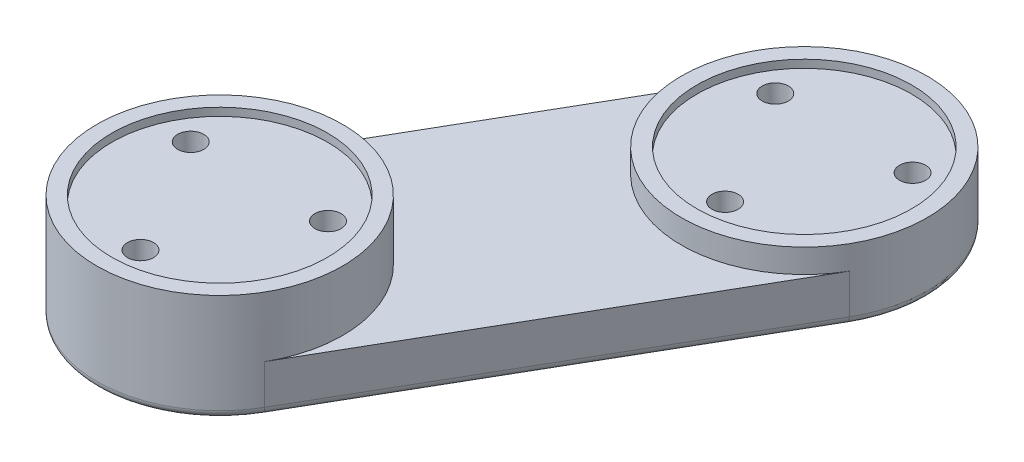
ISO-10303-21;
HEADER;
FILE_DESCRIPTION(('STEP AP214'),'2;1');
FILE_NAME('part.step','',(''),(''),'','','');
FILE_SCHEMA(('AUTOMOTIVE_DESIGN { 1 0 10303 214 1 1 1 1 }'));
ENDSEC;
DATA;
#1=APPLICATION_CONTEXT('core data for automotive mechanical design processes');
#2=APPLICATION_PROTOCOL_DEFINITION('international standard','automotive_design',2000,#1);
#3=PRODUCT_CONTEXT('',#1,'mechanical');
#4=PRODUCT('Part','Part','',(#3));
#5=PRODUCT_RELATED_PRODUCT_CATEGORY('part','',(#4));
#6=PRODUCT_DEFINITION_FORMATION('','',#4);
#7=PRODUCT_DEFINITION_CONTEXT('part definition',#1,'design');
#8=PRODUCT_DEFINITION('design','',#6,#7);
#9=PRODUCT_DEFINITION_SHAPE('','',#8);
#10=(LENGTH_UNIT() NAMED_UNIT(*) SI_UNIT(.MILLI.,.METRE.));
#11=(NAMED_UNIT(*) PLANE_ANGLE_UNIT() SI_UNIT($,.RADIAN.));
#12=(NAMED_UNIT(*) SI_UNIT($,.STERADIAN.) SOLID_ANGLE_UNIT());
#13=UNCERTAINTY_MEASURE_WITH_UNIT(LENGTH_MEASURE(1.E-05),#10,'distance_accuracy_value','');
#14=(GEOMETRIC_REPRESENTATION_CONTEXT(3) GLOBAL_UNCERTAINTY_ASSIGNED_CONTEXT((#13)) GLOBAL_UNIT_ASSIGNED_CONTEXT((#10,
#11,#12)) REPRESENTATION_CONTEXT('',''));
#15=CARTESIAN_POINT('',(0.,0.,0.));
#16=DIRECTION('',(0.,0.,1.));
#17=DIRECTION('',(1.,0.,0.));
#18=AXIS2_PLACEMENT_3D('',#15,#16,#17);
#19=CARTESIAN_POINT('',(2.25126265847052,64.,-99.5141091458864));
#20=DIRECTION('',(0.,1.,0.));
#21=DIRECTION('',(1.,0.,0.));
#22=AXIS2_PLACEMENT_3D('',#19,#20,#21);
#23=PLANE('',#22);
#24=CARTESIAN_POINT('',(2.25126265847052,64.,-99.5141091458864));
#25=DIRECTION('',(0.,1.,0.));
#26=DIRECTION('',(0.5,0.,-0.866025403784439));
#27=AXIS2_PLACEMENT_3D('',#24,#25,#26);
#28=CIRCLE('',#27,13.55);
#29=CARTESIAN_POINT('',(9.0262626584705,64.,-111.248753367165));
#30=VERTEX_POINT('',#29);
#31=EDGE_CURVE('E11',#30,#30,#28,.T.);
#32=ORIENTED_EDGE('',*,*,#31,.F.);
#33=EDGE_LOOP('',(#32));
#34=FACE_BOUND('',#33,.T.);
#35=CARTESIAN_POINT('',(2.25126265847052,64.,-99.5141091458864));
#36=DIRECTION('',(0.,1.,0.));
#37=DIRECTION('',(0.5,0.,-0.86602540378444));
#38=AXIS2_PLACEMENT_3D('',#35,#36,#37);
#39=CIRCLE('',#38,15.4999999999947);
#40=CARTESIAN_POINT('',(10.0012626584678,64.,-112.937502904541));
#41=VERTEX_POINT('',#40);
#42=EDGE_CURVE('E288',#41,#41,#39,.T.);
#43=ORIENTED_EDGE('',*,*,#42,.T.);
#44=EDGE_LOOP('',(#43));
#45=FACE_BOUND('',#44,.T.);
#46=ADVANCED_FACE('F16',(#34,#45),#23,.T.);
#47=CARTESIAN_POINT('',(2.25126265847052,64.,-99.5141091458864));
#48=DIRECTION('',(0.,-1.,0.));
#49=DIRECTION('',(-0.5,0.,0.866025403784439));
#50=AXIS2_PLACEMENT_3D('',#47,#48,#49);
#51=CYLINDRICAL_SURFACE('',#50,13.55);
#52=CARTESIAN_POINT('',(2.25126265847052,63.,-99.5141091458864));
#53=DIRECTION('',(0.,1.,0.));
#54=DIRECTION('',(0.5,0.,-0.866025403784439));
#55=AXIS2_PLACEMENT_3D('',#52,#53,#54);
#56=CIRCLE('',#55,13.55);
#57=CARTESIAN_POINT('',(9.0262626584705,63.,-111.248753367165));
#58=VERTEX_POINT('',#57);
#59=EDGE_CURVE('E366',#58,#58,#56,.T.);
#60=ORIENTED_EDGE('',*,*,#59,.F.);
#61=EDGE_LOOP('',(#60));
#62=FACE_BOUND('',#61,.T.);
#63=ORIENTED_EDGE('',*,*,#31,.T.);
#64=EDGE_LOOP('',(#63));
#65=FACE_BOUND('',#64,.T.);
#66=ADVANCED_FACE('F335',(#62,#65),#51,.F.);
#67=CARTESIAN_POINT('',(2.25126265847052,56.,-99.5141091458864));
#68=DIRECTION('',(0.,-1.,0.));
#69=DIRECTION('',(-0.5,0.,0.86602540378444));
#70=AXIS2_PLACEMENT_3D('',#67,#68,#69);
#71=TOROIDAL_SURFACE('',#70,14.4999999999947,1.);
#72=CARTESIAN_POINT('',(-10.3061056963993,56.,-106.764109145884));
#73=DIRECTION('',(0.5,0.,-0.86602540378444));
#74=DIRECTION('',(0.,-1.,0.));
#75=AXIS2_PLACEMENT_3D('',#72,#73,#74);
#76=CIRCLE('',#75,1.);
#77=CARTESIAN_POINT('',(-10.3061056963993,55.,-106.764109145884));
#78=VERTEX_POINT('',#77);
#79=CARTESIAN_POINT('',(-11.1721311001837,56.,-107.264109145884));
#80=VERTEX_POINT('',#79);
#81=EDGE_CURVE('E249',#78,#80,#76,.T.);
#82=ORIENTED_EDGE('',*,*,#81,.T.);
#83=CARTESIAN_POINT('',(2.25126265847052,56.,-99.5141091458864));
#84=DIRECTION('',(0.,1.,0.));
#85=DIRECTION('',(-0.5,0.,0.86602540378444));
#86=AXIS2_PLACEMENT_3D('',#83,#84,#85);
#87=CIRCLE('',#86,15.4999999999947);
#88=CARTESIAN_POINT('',(15.6746564171247,56.,-91.764109145889));
#89=VERTEX_POINT('',#88);
#90=EDGE_CURVE('E263',#89,#80,#87,.T.);
#91=ORIENTED_EDGE('',*,*,#90,.F.);
#92=CARTESIAN_POINT('',(14.8086310133403,56.,-92.264109145889));
#93=DIRECTION('',(0.5,0.,-0.86602540378444));
#94=DIRECTION('',(0.,-1.,0.));
#95=AXIS2_PLACEMENT_3D('',#92,#93,#94);
#96=CIRCLE('',#95,1.);
#97=CARTESIAN_POINT('',(14.8086310133403,55.,-92.264109145889));
#98=VERTEX_POINT('',#97);
#99=EDGE_CURVE('E24',#89,#98,#96,.T.);
#100=ORIENTED_EDGE('',*,*,#99,.T.);
#101=CARTESIAN_POINT('',(2.25126265847052,55.,-99.5141091458864));
#102=DIRECTION('',(0.,-1.,0.));
#103=DIRECTION('',(-0.5,0.,0.86602540378444));
#104=AXIS2_PLACEMENT_3D('',#101,#102,#103);
#105=CIRCLE('',#104,14.4999999999947);
#106=EDGE_CURVE('E260',#78,#98,#105,.T.);
#107=ORIENTED_EDGE('',*,*,#106,.F.);
#108=EDGE_LOOP('',(#82,#91,#100,#107));
#109=FACE_BOUND('',#108,.T.);
#110=ADVANCED_FACE('F258',(#109),#71,.T.);
#111=CARTESIAN_POINT('',(14.8086310133403,56.,-92.264109145889));
#112=DIRECTION('',(-0.5,0.,0.86602540378444));
#113=DIRECTION('',(0.,1.,0.));
#114=AXIS2_PLACEMENT_3D('',#111,#112,#113);
#115=CYLINDRICAL_SURFACE('',#114,1.);
#116=CARTESIAN_POINT('',(-12.1913689866596,56.,-45.4987373415293));
#117=DIRECTION('',(0.499999999999994,0.,-0.866025403784442));
#118=DIRECTION('',(-0.866025403784442,0.,-0.499999999999994));
#119=AXIS2_PLACEMENT_3D('',#116,#117,#118);
#120=CIRCLE('',#119,1.);
#121=CARTESIAN_POINT('',(-11.3253435828751,56.,-44.9987373415293));
#122=VERTEX_POINT('',#121);
#123=CARTESIAN_POINT('',(-12.1913689866596,55.,-45.4987373415293));
#124=VERTEX_POINT('',#123);
#125=EDGE_CURVE('E243',#122,#124,#120,.T.);
#126=ORIENTED_EDGE('',*,*,#125,.T.);
#127=DIRECTION('',(-0.5,0.,0.86602540378444));
#128=VECTOR('',#127,1.);
#129=CARTESIAN_POINT('',(14.8086310133403,55.,-92.264109145889));
#130=LINE('',#129,#128);
#131=EDGE_CURVE('E268',#98,#124,#130,.T.);
#132=ORIENTED_EDGE('',*,*,#131,.F.);
#133=ORIENTED_EDGE('',*,*,#99,.F.);
#134=DIRECTION('',(0.5,0.,-0.86602540378444));
#135=VECTOR('',#134,1.);
#136=CARTESIAN_POINT('',(15.6746564171247,56.,-91.764109145889));
#137=LINE('',#136,#135);
#138=EDGE_CURVE('E236',#122,#89,#137,.T.);
#139=ORIENTED_EDGE('',*,*,#138,.F.);
#140=EDGE_LOOP('',(#126,#132,#133,#139));
#141=FACE_BOUND('',#140,.T.);
#142=ADVANCED_FACE('F269',(#141),#115,.T.);
#143=CARTESIAN_POINT('',(-10.3061056963993,56.,-106.764109145884));
#144=DIRECTION('',(0.5,0.,-0.86602540378444));
#145=DIRECTION('',(0.,-1.,0.));
#146=AXIS2_PLACEMENT_3D('',#143,#144,#145);
#147=CYLINDRICAL_SURFACE('',#146,1.);
#148=CARTESIAN_POINT('',(-37.3061056963992,56.,-59.9987373415239));
#149=DIRECTION('',(0.5,0.,-0.86602540378444));
#150=DIRECTION('',(0.,-1.,0.));
#151=AXIS2_PLACEMENT_3D('',#148,#149,#150);
#152=CIRCLE('',#151,1.);
#153=CARTESIAN_POINT('',(-37.3061056963992,55.,-59.9987373415239));
#154=VERTEX_POINT('',#153);
#155=CARTESIAN_POINT('',(-38.1721311001836,56.,-60.4987373415239));
#156=VERTEX_POINT('',#155);
#157=EDGE_CURVE('E246',#154,#156,#152,.T.);
#158=ORIENTED_EDGE('',*,*,#157,.T.);
#159=DIRECTION('',(-0.5,0.,0.86602540378444));
#160=VECTOR('',#159,1.);
#161=CARTESIAN_POINT('',(-38.1721311001836,56.,-60.4987373415239));
#162=LINE('',#161,#160);
#163=EDGE_CURVE('E229',#80,#156,#162,.T.);
#164=ORIENTED_EDGE('',*,*,#163,.F.);
#165=ORIENTED_EDGE('',*,*,#81,.F.);
#166=DIRECTION('',(0.5,0.,-0.86602540378444));
#167=VECTOR('',#166,1.);
#168=CARTESIAN_POINT('',(-10.3061056963993,55.,-106.764109145884));
#169=LINE('',#168,#167);
#170=EDGE_CURVE('E278',#154,#78,#169,.T.);
#171=ORIENTED_EDGE('',*,*,#170,.F.);
#172=EDGE_LOOP('',(#158,#164,#165,#171));
#173=FACE_BOUND('',#172,.T.);
#174=ADVANCED_FACE('F684',(#173),#147,.T.);
#175=CARTESIAN_POINT('',(-24.7487373415294,56.,-52.7487373415266));
#176=DIRECTION('',(0.,-1.,0.));
#177=DIRECTION('',(-0.5,0.,0.866025403784439));
#178=AXIS2_PLACEMENT_3D('',#175,#176,#177);
#179=TOROIDAL_SURFACE('',#178,14.4999999999947,1.);
#180=ORIENTED_EDGE('',*,*,#125,.F.);
#181=CARTESIAN_POINT('',(-24.7487373415294,56.,-52.7487373415266));
#182=DIRECTION('',(0.,1.,0.));
#183=DIRECTION('',(-0.5,0.,0.866025403784439));
#184=AXIS2_PLACEMENT_3D('',#181,#182,#183);
#185=CIRCLE('',#184,15.4999999999947);
#186=EDGE_CURVE('E205',#156,#122,#185,.T.);
#187=ORIENTED_EDGE('',*,*,#186,.F.);
#188=ORIENTED_EDGE('',*,*,#157,.F.);
#189=CARTESIAN_POINT('',(-24.7487373415294,55.,-52.7487373415266));
#190=DIRECTION('',(0.,-1.,0.));
#191=DIRECTION('',(-0.5,0.,0.86602540378444));
#192=AXIS2_PLACEMENT_3D('',#189,#190,#191);
#193=CIRCLE('',#192,14.4999999999947);
#194=EDGE_CURVE('E274',#124,#154,#193,.T.);
#195=ORIENTED_EDGE('',*,*,#194,.F.);
#196=EDGE_LOOP('',(#180,#187,#188,#195));
#197=FACE_BOUND('',#196,.T.);
#198=ADVANCED_FACE('F692',(#197),#179,.T.);
#199=CARTESIAN_POINT('',(-24.7487373415294,61.,-52.7487373415266));
#200=DIRECTION('',(0.,1.,0.));
#201=DIRECTION('',(1.,0.,0.));
#202=AXIS2_PLACEMENT_3D('',#199,#200,#201);
#203=PLANE('',#202);
#204=CARTESIAN_POINT('',(-24.7487373415294,61.,-52.7487373415266));
#205=DIRECTION('',(0.,1.,0.));
#206=DIRECTION('',(0.5,0.,-0.866025403784439));
#207=AXIS2_PLACEMENT_3D('',#204,#205,#206);
#208=CIRCLE('',#207,15.4999999999947);
#209=CARTESIAN_POINT('',(-11.3253435828751,61.,-44.9987373415293));
#210=VERTEX_POINT('',#209);
#211=CARTESIAN_POINT('',(-38.1721311001836,61.,-60.4987373415239));
#212=VERTEX_POINT('',#211);
#213=EDGE_CURVE('E213',#210,#212,#208,.T.);
#214=ORIENTED_EDGE('',*,*,#213,.F.);
#215=DIRECTION('',(-0.5,0.,0.86602540378444));
#216=VECTOR('',#215,1.);
#217=CARTESIAN_POINT('',(15.6746564171247,61.,-91.764109145889));
#218=LINE('',#217,#216);
#219=CARTESIAN_POINT('',(15.6746564171247,61.,-91.764109145889));
#220=VERTEX_POINT('',#219);
#221=EDGE_CURVE('E240',#220,#210,#218,.T.);
#222=ORIENTED_EDGE('',*,*,#221,.F.);
#223=CARTESIAN_POINT('',(2.25126265847051,61.,-99.5141091458864));
#224=DIRECTION('',(0.,1.,0.));
#225=DIRECTION('',(-0.5,0.,0.86602540378444));
#226=AXIS2_PLACEMENT_3D('',#223,#224,#225);
#227=CIRCLE('',#226,15.4999999999947);
#228=CARTESIAN_POINT('',(-11.1721311001837,61.,-107.264109145884));
#229=VERTEX_POINT('',#228);
#230=EDGE_CURVE('E345',#229,#220,#227,.T.);
#231=ORIENTED_EDGE('',*,*,#230,.F.);
#232=DIRECTION('',(0.5,0.,-0.86602540378444));
#233=VECTOR('',#232,1.);
#234=CARTESIAN_POINT('',(-38.1721311001836,61.,-60.4987373415239));
#235=LINE('',#234,#233);
#236=EDGE_CURVE('E233',#212,#229,#235,.T.);
#237=ORIENTED_EDGE('',*,*,#236,.F.);
#238=EDGE_LOOP('',(#214,#222,#231,#237));
#239=FACE_BOUND('',#238,.T.);
#240=ADVANCED_FACE('F701',(#239),#203,.T.);
#241=CARTESIAN_POINT('',(15.6746564171247,61.,-91.764109145889));
#242=DIRECTION('',(0.86602540378444,0.,0.5));
#243=DIRECTION('',(0.,-1.,0.));
#244=AXIS2_PLACEMENT_3D('',#241,#242,#243);
#245=PLANE('',#244);
#246=DIRECTION('',(0.,-1.,0.));
#247=VECTOR('',#246,1.);
#248=CARTESIAN_POINT('',(-11.3253435828751,61.,-44.9987373415293));
#249=LINE('',#248,#247);
#250=EDGE_CURVE('E209',#210,#122,#249,.T.);
#251=ORIENTED_EDGE('',*,*,#250,.T.);
#252=ORIENTED_EDGE('',*,*,#138,.T.);
#253=DIRECTION('',(0.,-1.,0.));
#254=VECTOR('',#253,1.);
#255=CARTESIAN_POINT('',(15.6746564171247,61.,-91.764109145889));
#256=LINE('',#255,#254);
#257=EDGE_CURVE('E365',#220,#89,#256,.T.);
#258=ORIENTED_EDGE('',*,*,#257,.F.);
#259=ORIENTED_EDGE('',*,*,#221,.T.);
#260=EDGE_LOOP('',(#251,#252,#258,#259));
#261=FACE_BOUND('',#260,.T.);
#262=ADVANCED_FACE('F710',(#261),#245,.T.);
#263=CARTESIAN_POINT('',(-38.1721311001836,61.,-60.4987373415239));
#264=DIRECTION('',(-0.86602540378444,0.,-0.5));
#265=DIRECTION('',(-0.5,0.,0.86602540378444));
#266=AXIS2_PLACEMENT_3D('',#263,#264,#265);
#267=PLANE('',#266);
#268=DIRECTION('',(0.,-1.,0.));
#269=VECTOR('',#268,1.);
#270=CARTESIAN_POINT('',(-11.1721311001837,61.,-107.264109145884));
#271=LINE('',#270,#269);
#272=EDGE_CURVE('E350',#229,#80,#271,.T.);
#273=ORIENTED_EDGE('',*,*,#272,.T.);
#274=ORIENTED_EDGE('',*,*,#163,.T.);
#275=DIRECTION('',(0.,-1.,0.));
#276=VECTOR('',#275,1.);
#277=CARTESIAN_POINT('',(-38.1721311001836,61.,-60.4987373415239));
#278=LINE('',#277,#276);
#279=EDGE_CURVE('E201',#212,#156,#278,.T.);
#280=ORIENTED_EDGE('',*,*,#279,.F.);
#281=ORIENTED_EDGE('',*,*,#236,.T.);
#282=EDGE_LOOP('',(#273,#274,#280,#281));
#283=FACE_BOUND('',#282,.T.);
#284=ADVANCED_FACE('F719',(#283),#267,.T.);
#285=CARTESIAN_POINT('',(-24.7487373415294,68.6,-52.7487373415266));
#286=DIRECTION('',(0.,1.,0.));
#287=DIRECTION('',(1.,0.,0.));
#288=AXIS2_PLACEMENT_3D('',#285,#286,#287);
#289=PLANE('',#288);
#290=CARTESIAN_POINT('',(-24.7487373415294,68.6,-52.7487373415266));
#291=DIRECTION('',(0.,1.,0.));
#292=DIRECTION('',(0.5,0.,-0.866025403784439));
#293=AXIS2_PLACEMENT_3D('',#290,#291,#292);
#294=CIRCLE('',#293,13.6);
#295=CARTESIAN_POINT('',(-17.9487373415294,68.6,-64.526682832995));
#296=VERTEX_POINT('',#295);
#297=EDGE_CURVE('E39',#296,#296,#294,.T.);
#298=ORIENTED_EDGE('',*,*,#297,.F.);
#299=EDGE_LOOP('',(#298));
#300=FACE_BOUND('',#299,.T.);
#301=CARTESIAN_POINT('',(-24.7487373415294,68.6,-52.7487373415266));
#302=DIRECTION('',(0.,1.,0.));
#303=DIRECTION('',(0.5,0.,-0.866025403784439));
#304=AXIS2_PLACEMENT_3D('',#301,#302,#303);
#305=CIRCLE('',#304,15.4999999999947);
#306=CARTESIAN_POINT('',(-16.9987373415321,68.6,-66.1721311001808));
#307=VERTEX_POINT('',#306);
#308=EDGE_CURVE('E198',#307,#307,#305,.T.);
#309=ORIENTED_EDGE('',*,*,#308,.T.);
#310=EDGE_LOOP('',(#309));
#311=FACE_BOUND('',#310,.T.);
#312=ADVANCED_FACE('F330',(#300,#311),#289,.T.);
#313=CARTESIAN_POINT('',(-24.7487373415294,68.6,-52.7487373415266));
#314=DIRECTION('',(0.,-1.,0.));
#315=DIRECTION('',(-0.5,0.,0.86602540378444));
#316=AXIS2_PLACEMENT_3D('',#313,#314,#315);
#317=CYLINDRICAL_SURFACE('',#316,13.6);
#318=CARTESIAN_POINT('',(-24.7487373415294,67.6,-52.7487373415266));
#319=DIRECTION('',(0.,1.,0.));
#320=DIRECTION('',(0.5,0.,-0.866025403784439));
#321=AXIS2_PLACEMENT_3D('',#318,#319,#320);
#322=CIRCLE('',#321,13.6);
#323=CARTESIAN_POINT('',(-17.9487373415294,67.6,-64.526682832995));
#324=VERTEX_POINT('',#323);
#325=EDGE_CURVE('E183',#324,#324,#322,.T.);
#326=ORIENTED_EDGE('',*,*,#325,.F.);
#327=EDGE_LOOP('',(#326));
#328=FACE_BOUND('',#327,.T.);
#329=ORIENTED_EDGE('',*,*,#297,.T.);
#330=EDGE_LOOP('',(#329));
#331=FACE_BOUND('',#330,.T.);
#332=ADVANCED_FACE('F320',(#328,#331),#317,.F.);
#333=CARTESIAN_POINT('',(-16.088483303685,57.,-57.7487373415266));
#334=DIRECTION('',(0.,-1.,0.));
#335=DIRECTION('',(-0.5,0.,0.86602540378444));
#336=AXIS2_PLACEMENT_3D('',#333,#334,#335);
#337=CONICAL_SURFACE('',#336,1.65,0.7853981625);
#338=CARTESIAN_POINT('',(-16.088483303685,57.,-57.7487373415266));
#339=DIRECTION('',(0.,-1.,0.));
#340=DIRECTION('',(0.5,0.,-0.86602540378444));
#341=AXIS2_PLACEMENT_3D('',#338,#339,#340);
#342=CIRCLE('',#341,1.65);
#343=CARTESIAN_POINT('',(-15.263483303685,57.,-59.1776792577709));
#344=VERTEX_POINT('',#343);
#345=EDGE_CURVE('E190',#344,#344,#342,.T.);
#346=ORIENTED_EDGE('',*,*,#345,.F.);
#347=EDGE_LOOP('',(#346));
#348=FACE_BOUND('',#347,.T.);
#349=CARTESIAN_POINT('',(-16.088483303685,55.,-57.7487373415266));
#350=DIRECTION('',(0.,1.,0.));
#351=DIRECTION('',(0.5,0.,-0.86602540378444));
#352=AXIS2_PLACEMENT_3D('',#349,#350,#351);
#353=CIRCLE('',#352,3.65);
#354=CARTESIAN_POINT('',(-14.263483303685,55.,-60.9097300653398));
#355=VERTEX_POINT('',#354);
#356=EDGE_CURVE('E196',#355,#355,#353,.T.);
#357=ORIENTED_EDGE('',*,*,#356,.F.);
#358=EDGE_LOOP('',(#357));
#359=FACE_BOUND('',#358,.T.);
#360=ADVANCED_FACE('F317',(#348,#359),#337,.F.);
#361=CARTESIAN_POINT('',(-24.7487373415294,57.,-42.7487373415266));
#362=DIRECTION('',(0.,-1.,0.));
#363=DIRECTION('',(-0.5,0.,0.86602540378444));
#364=AXIS2_PLACEMENT_3D('',#361,#362,#363);
#365=CONICAL_SURFACE('',#364,1.65,0.7853981625);
#366=CARTESIAN_POINT('',(-24.7487373415294,57.,-42.7487373415266));
#367=DIRECTION('',(0.,-1.,0.));
#368=DIRECTION('',(0.5,0.,-0.86602540378444));
#369=AXIS2_PLACEMENT_3D('',#366,#367,#368);
#370=CIRCLE('',#369,1.65);
#371=CARTESIAN_POINT('',(-23.9237373415294,57.,-44.1776792577709));
#372=VERTEX_POINT('',#371);
#373=EDGE_CURVE('E178',#372,#372,#370,.T.);
#374=ORIENTED_EDGE('',*,*,#373,.F.);
#375=EDGE_LOOP('',(#374));
#376=FACE_BOUND('',#375,.T.);
#377=CARTESIAN_POINT('',(-24.7487373415294,55.,-42.7487373415266));
#378=DIRECTION('',(0.,1.,0.));
#379=DIRECTION('',(0.5,0.,-0.86602540378444));
#380=AXIS2_PLACEMENT_3D('',#377,#378,#379);
#381=CIRCLE('',#380,3.65);
#382=CARTESIAN_POINT('',(-22.9237373415294,55.,-45.9097300653398));
#383=VERTEX_POINT('',#382);
#384=EDGE_CURVE('E304',#383,#383,#381,.T.);
#385=ORIENTED_EDGE('',*,*,#384,.F.);
#386=EDGE_LOOP('',(#385));
#387=FACE_BOUND('',#386,.T.);
#388=ADVANCED_FACE('F319',(#376,#387),#365,.F.);
#389=CARTESIAN_POINT('',(-33.4089913793738,57.,-57.7487373415266));
#390=DIRECTION('',(0.,-1.,0.));
#391=DIRECTION('',(-0.5,0.,0.86602540378444));
#392=AXIS2_PLACEMENT_3D('',#389,#390,#391);
#393=CONICAL_SURFACE('',#392,1.65,0.7853981625);
#394=CARTESIAN_POINT('',(-33.4089913793738,57.,-57.7487373415266));
#395=DIRECTION('',(0.,-1.,0.));
#396=DIRECTION('',(0.5,0.,-0.866025403784439));
#397=AXIS2_PLACEMENT_3D('',#394,#395,#396);
#398=CIRCLE('',#397,1.65);
#399=CARTESIAN_POINT('',(-32.5839913793738,57.,-59.1776792577709));
#400=VERTEX_POINT('',#399);
#401=EDGE_CURVE('E182',#400,#400,#398,.T.);
#402=ORIENTED_EDGE('',*,*,#401,.F.);
#403=EDGE_LOOP('',(#402));
#404=FACE_BOUND('',#403,.T.);
#405=CARTESIAN_POINT('',(-33.4089913793738,55.,-57.7487373415266));
#406=DIRECTION('',(0.,1.,0.));
#407=DIRECTION('',(0.5,0.,-0.86602540378444));
#408=AXIS2_PLACEMENT_3D('',#405,#406,#407);
#409=CIRCLE('',#408,3.65);
#410=CARTESIAN_POINT('',(-31.5839913793738,55.,-60.9097300653398));
#411=VERTEX_POINT('',#410);
#412=EDGE_CURVE('E302',#411,#411,#409,.T.);
#413=ORIENTED_EDGE('',*,*,#412,.F.);
#414=EDGE_LOOP('',(#413));
#415=FACE_BOUND('',#414,.T.);
#416=ADVANCED_FACE('F328',(#404,#415),#393,.F.);
#417=CARTESIAN_POINT('',(-16.088483303685,-57.14,-57.7487373415266));
#418=DIRECTION('',(0.,1.,0.));
#419=DIRECTION('',(0.5,0.,-0.86602540378444));
#420=AXIS2_PLACEMENT_3D('',#417,#418,#419);
#421=CYLINDRICAL_SURFACE('',#420,1.65);
#422=CARTESIAN_POINT('',(-16.088483303685,67.6,-57.7487373415266));
#423=DIRECTION('',(0.,1.,0.));
#424=DIRECTION('',(0.5,0.,0.86602540378444));
#425=AXIS2_PLACEMENT_3D('',#422,#423,#424);
#426=CIRCLE('',#425,1.65);
#427=CARTESIAN_POINT('',(-15.263483303685,67.6,-56.3197954252823));
#428=VERTEX_POINT('',#427);
#429=EDGE_CURVE('E192',#428,#428,#426,.T.);
#430=ORIENTED_EDGE('',*,*,#429,.T.);
#431=EDGE_LOOP('',(#430));
#432=FACE_BOUND('',#431,.T.);
#433=ORIENTED_EDGE('',*,*,#345,.T.);
#434=EDGE_LOOP('',(#433));
#435=FACE_BOUND('',#434,.T.);
#436=ADVANCED_FACE('F426',(#432,#435),#421,.F.);
#437=CARTESIAN_POINT('',(-33.4089913793738,-57.14,-57.7487373415266));
#438=DIRECTION('',(0.,1.,0.));
#439=DIRECTION('',(0.5,0.,-0.866025403784439));
#440=AXIS2_PLACEMENT_3D('',#437,#438,#439);
#441=CYLINDRICAL_SURFACE('',#440,1.65);
#442=CARTESIAN_POINT('',(-33.4089913793738,67.6,-57.7487373415266));
#443=DIRECTION('',(0.,1.,0.));
#444=DIRECTION('',(0.5,0.,-0.866025403784439));
#445=AXIS2_PLACEMENT_3D('',#442,#443,#444);
#446=CIRCLE('',#445,1.65);
#447=CARTESIAN_POINT('',(-32.5839913793738,67.6,-59.1776792577709));
#448=VERTEX_POINT('',#447);
#449=EDGE_CURVE('E220',#448,#448,#446,.T.);
#450=ORIENTED_EDGE('',*,*,#449,.T.);
#451=EDGE_LOOP('',(#450));
#452=FACE_BOUND('',#451,.T.);
#453=ORIENTED_EDGE('',*,*,#401,.T.);
#454=EDGE_LOOP('',(#453));
#455=FACE_BOUND('',#454,.T.);
#456=ADVANCED_FACE('F422',(#452,#455),#441,.F.);
#457=CARTESIAN_POINT('',(-24.7487373415294,-57.14,-42.7487373415266));
#458=DIRECTION('',(0.,1.,0.));
#459=DIRECTION('',(0.5,0.,-0.86602540378444));
#460=AXIS2_PLACEMENT_3D('',#457,#458,#459);
#461=CYLINDRICAL_SURFACE('',#460,1.65);
#462=CARTESIAN_POINT('',(-24.7487373415294,67.6,-42.7487373415266));
#463=DIRECTION('',(0.,1.,0.));
#464=DIRECTION('',(-1.,0.,0.));
#465=AXIS2_PLACEMENT_3D('',#462,#463,#464);
#466=CIRCLE('',#465,1.65);
#467=CARTESIAN_POINT('',(-26.3987373415294,67.6,-42.7487373415266));
#468=VERTEX_POINT('',#467);
#469=EDGE_CURVE('E217',#468,#468,#466,.T.);
#470=ORIENTED_EDGE('',*,*,#469,.T.);
#471=EDGE_LOOP('',(#470));
#472=FACE_BOUND('',#471,.T.);
#473=ORIENTED_EDGE('',*,*,#373,.T.);
#474=EDGE_LOOP('',(#473));
#475=FACE_BOUND('',#474,.T.);
#476=ADVANCED_FACE('F179',(#472,#475),#461,.F.);
#477=CARTESIAN_POINT('',(-24.7487373415294,67.6,-52.7487373415266));
#478=DIRECTION('',(0.,1.,0.));
#479=DIRECTION('',(1.,0.,0.));
#480=AXIS2_PLACEMENT_3D('',#477,#478,#479);
#481=PLANE('',#480);
#482=ORIENTED_EDGE('',*,*,#325,.T.);
#483=EDGE_LOOP('',(#482));
#484=FACE_BOUND('',#483,.T.);
#485=ORIENTED_EDGE('',*,*,#429,.F.);
#486=EDGE_LOOP('',(#485));
#487=FACE_BOUND('',#486,.T.);
#488=ORIENTED_EDGE('',*,*,#449,.F.);
#489=EDGE_LOOP('',(#488));
#490=FACE_BOUND('',#489,.T.);
#491=ORIENTED_EDGE('',*,*,#469,.F.);
#492=EDGE_LOOP('',(#491));
#493=FACE_BOUND('',#492,.T.);
#494=ADVANCED_FACE('F418',(#484,#487,#490,#493),#481,.T.);
#495=CARTESIAN_POINT('',(-24.7487373415294,67.6,-52.7487373415266));
#496=DIRECTION('',(0.,-1.,0.));
#497=DIRECTION('',(-0.5,0.,0.866025403784439));
#498=AXIS2_PLACEMENT_3D('',#495,#496,#497);
#499=CYLINDRICAL_SURFACE('',#498,15.4999999999947);
#500=ORIENTED_EDGE('',*,*,#279,.T.);
#501=ORIENTED_EDGE('',*,*,#186,.T.);
#502=ORIENTED_EDGE('',*,*,#250,.F.);
#503=ORIENTED_EDGE('',*,*,#213,.T.);
#504=EDGE_LOOP('',(#500,#501,#502,#503));
#505=FACE_BOUND('',#504,.T.);
#506=ORIENTED_EDGE('',*,*,#308,.F.);
#507=EDGE_LOOP('',(#506));
#508=FACE_BOUND('',#507,.T.);
#509=ADVANCED_FACE('F414',(#505,#508),#499,.T.);
#510=CARTESIAN_POINT('',(2.25126265847057,55.,-89.5141091458864));
#511=DIRECTION('',(0.,-1.,0.));
#512=DIRECTION('',(-0.5,0.,0.86602540378444));
#513=AXIS2_PLACEMENT_3D('',#510,#511,#512);
#514=CONICAL_SURFACE('',#513,3.65,0.7853981625);
#515=CARTESIAN_POINT('',(2.25126265847057,55.,-89.5141091458864));
#516=DIRECTION('',(0.,-1.,0.));
#517=DIRECTION('',(-0.5,0.,0.86602540378444));
#518=AXIS2_PLACEMENT_3D('',#515,#516,#517);
#519=CIRCLE('',#518,3.65);
#520=CARTESIAN_POINT('',(0.426262658470579,55.,-86.3531164220732));
#521=VERTEX_POINT('',#520);
#522=EDGE_CURVE('E305',#521,#521,#519,.T.);
#523=ORIENTED_EDGE('',*,*,#522,.T.);
#524=EDGE_LOOP('',(#523));
#525=FACE_BOUND('',#524,.T.);
#526=CARTESIAN_POINT('',(2.25126265847057,57.,-89.5141091458864));
#527=DIRECTION('',(0.,1.,0.));
#528=DIRECTION('',(-0.5,0.,0.866025403784439));
#529=AXIS2_PLACEMENT_3D('',#526,#527,#528);
#530=CIRCLE('',#529,1.65);
#531=CARTESIAN_POINT('',(1.42626265847058,57.,-88.0851672296421));
#532=VERTEX_POINT('',#531);
#533=EDGE_CURVE('E293',#532,#532,#530,.T.);
#534=ORIENTED_EDGE('',*,*,#533,.T.);
#535=EDGE_LOOP('',(#534));
#536=FACE_BOUND('',#535,.T.);
#537=ADVANCED_FACE('F407',(#525,#536),#514,.F.);
#538=CARTESIAN_POINT('',(10.9115166963149,55.,-104.514109145886));
#539=DIRECTION('',(0.,-1.,0.));
#540=DIRECTION('',(-0.5,0.,0.86602540378444));
#541=AXIS2_PLACEMENT_3D('',#538,#539,#540);
#542=CONICAL_SURFACE('',#541,3.65,0.7853981625);
#543=CARTESIAN_POINT('',(10.9115166963149,55.,-104.514109145886));
#544=DIRECTION('',(0.,-1.,0.));
#545=DIRECTION('',(-0.5,0.,0.86602540378444));
#546=AXIS2_PLACEMENT_3D('',#543,#544,#545);
#547=CIRCLE('',#546,3.65);
#548=CARTESIAN_POINT('',(9.08651669631493,55.,-101.353116422073));
#549=VERTEX_POINT('',#548);
#550=EDGE_CURVE('E299',#549,#549,#547,.T.);
#551=ORIENTED_EDGE('',*,*,#550,.T.);
#552=EDGE_LOOP('',(#551));
#553=FACE_BOUND('',#552,.T.);
#554=CARTESIAN_POINT('',(10.9115166963149,57.,-104.514109145886));
#555=DIRECTION('',(0.,1.,0.));
#556=DIRECTION('',(-0.5,0.,0.866025403784439));
#557=AXIS2_PLACEMENT_3D('',#554,#555,#556);
#558=CIRCLE('',#557,1.65);
#559=CARTESIAN_POINT('',(10.0865166963149,57.,-103.085167229642));
#560=VERTEX_POINT('',#559);
#561=EDGE_CURVE('E290',#560,#560,#558,.T.);
#562=ORIENTED_EDGE('',*,*,#561,.T.);
#563=EDGE_LOOP('',(#562));
#564=FACE_BOUND('',#563,.T.);
#565=ADVANCED_FACE('F404',(#553,#564),#542,.F.);
#566=CARTESIAN_POINT('',(-6.40899137937388,55.,-104.514109145886));
#567=DIRECTION('',(0.,-1.,0.));
#568=DIRECTION('',(-0.5,0.,0.86602540378444));
#569=AXIS2_PLACEMENT_3D('',#566,#567,#568);
#570=CONICAL_SURFACE('',#569,3.65,0.7853981625);
#571=CARTESIAN_POINT('',(-6.40899137937388,55.,-104.514109145886));
#572=DIRECTION('',(0.,-1.,0.));
#573=DIRECTION('',(-0.5,0.,0.86602540378444));
#574=AXIS2_PLACEMENT_3D('',#571,#572,#573);
#575=CIRCLE('',#574,3.65);
#576=CARTESIAN_POINT('',(-8.23399137937387,55.,-101.353116422073));
#577=VERTEX_POINT('',#576);
#578=EDGE_CURVE('E296',#577,#577,#575,.T.);
#579=ORIENTED_EDGE('',*,*,#578,.T.);
#580=EDGE_LOOP('',(#579));
#581=FACE_BOUND('',#580,.T.);
#582=CARTESIAN_POINT('',(-6.40899137937388,57.,-104.514109145886));
#583=DIRECTION('',(0.,1.,0.));
#584=DIRECTION('',(-0.5,0.,0.866025403784439));
#585=AXIS2_PLACEMENT_3D('',#582,#583,#584);
#586=CIRCLE('',#585,1.65);
#587=CARTESIAN_POINT('',(-7.23399137937387,57.,-103.085167229642));
#588=VERTEX_POINT('',#587);
#589=EDGE_CURVE('E284',#588,#588,#586,.T.);
#590=ORIENTED_EDGE('',*,*,#589,.T.);
#591=EDGE_LOOP('',(#590));
#592=FACE_BOUND('',#591,.T.);
#593=ADVANCED_FACE('F387',(#581,#592),#570,.F.);
#594=CARTESIAN_POINT('',(2.25126265847052,55.,-99.5141091458864));
#595=DIRECTION('',(0.,-1.,0.));
#596=DIRECTION('',(0.,0.,-1.));
#597=AXIS2_PLACEMENT_3D('',#594,#595,#596);
#598=PLANE('',#597);
#599=ORIENTED_EDGE('',*,*,#356,.T.);
#600=EDGE_LOOP('',(#599));
#601=FACE_BOUND('',#600,.T.);
#602=ORIENTED_EDGE('',*,*,#384,.T.);
#603=EDGE_LOOP('',(#602));
#604=FACE_BOUND('',#603,.T.);
#605=ORIENTED_EDGE('',*,*,#412,.T.);
#606=EDGE_LOOP('',(#605));
#607=FACE_BOUND('',#606,.T.);
#608=ORIENTED_EDGE('',*,*,#522,.F.);
#609=EDGE_LOOP('',(#608));
#610=FACE_BOUND('',#609,.T.);
#611=ORIENTED_EDGE('',*,*,#550,.F.);
#612=EDGE_LOOP('',(#611));
#613=FACE_BOUND('',#612,.T.);
#614=ORIENTED_EDGE('',*,*,#578,.F.);
#615=EDGE_LOOP('',(#614));
#616=FACE_BOUND('',#615,.T.);
#617=ORIENTED_EDGE('',*,*,#170,.T.);
#618=ORIENTED_EDGE('',*,*,#106,.T.);
#619=ORIENTED_EDGE('',*,*,#131,.T.);
#620=ORIENTED_EDGE('',*,*,#194,.T.);
#621=EDGE_LOOP('',(#617,#618,#619,#620));
#622=FACE_BOUND('',#621,.T.);
#623=ADVANCED_FACE('F276',(#601,#604,#607,#610,#613,#616,#622),#598,.T.);
#624=CARTESIAN_POINT('',(-6.40899137937388,-57.14,-104.514109145886));
#625=DIRECTION('',(0.,1.,0.));
#626=DIRECTION('',(0.5,0.,-0.866025403784438));
#627=AXIS2_PLACEMENT_3D('',#624,#625,#626);
#628=CYLINDRICAL_SURFACE('',#627,1.65);
#629=CARTESIAN_POINT('',(-6.40899137937388,63.,-104.514109145886));
#630=DIRECTION('',(0.,1.,0.));
#631=DIRECTION('',(0.5,0.,-0.866025403784439));
#632=AXIS2_PLACEMENT_3D('',#629,#630,#631);
#633=CIRCLE('',#632,1.65);
#634=CARTESIAN_POINT('',(-5.58399137937388,63.,-105.943051062131));
#635=VERTEX_POINT('',#634);
#636=EDGE_CURVE('E377',#635,#635,#633,.T.);
#637=ORIENTED_EDGE('',*,*,#636,.T.);
#638=EDGE_LOOP('',(#637));
#639=FACE_BOUND('',#638,.T.);
#640=ORIENTED_EDGE('',*,*,#589,.F.);
#641=EDGE_LOOP('',(#640));
#642=FACE_BOUND('',#641,.T.);
#643=ADVANCED_FACE('F389',(#639,#642),#628,.F.);
#644=CARTESIAN_POINT('',(2.25126265847057,-57.14,-89.5141091458864));
#645=DIRECTION('',(0.,1.,0.));
#646=DIRECTION('',(0.5,0.,-0.866025403784438));
#647=AXIS2_PLACEMENT_3D('',#644,#645,#646);
#648=CYLINDRICAL_SURFACE('',#647,1.65);
#649=CARTESIAN_POINT('',(2.25126265847057,63.,-89.5141091458864));
#650=DIRECTION('',(0.,1.,0.));
#651=DIRECTION('',(0.5,0.,-0.866025403784439));
#652=AXIS2_PLACEMENT_3D('',#649,#650,#651);
#653=CIRCLE('',#652,1.65);
#654=CARTESIAN_POINT('',(3.07626265847057,63.,-90.9430510621307));
#655=VERTEX_POINT('',#654);
#656=EDGE_CURVE('E372',#655,#655,#653,.T.);
#657=ORIENTED_EDGE('',*,*,#656,.T.);
#658=EDGE_LOOP('',(#657));
#659=FACE_BOUND('',#658,.T.);
#660=ORIENTED_EDGE('',*,*,#533,.F.);
#661=EDGE_LOOP('',(#660));
#662=FACE_BOUND('',#661,.T.);
#663=ADVANCED_FACE('F391',(#659,#662),#648,.F.);
#664=CARTESIAN_POINT('',(10.9115166963149,-57.14,-104.514109145886));
#665=DIRECTION('',(0.,1.,0.));
#666=DIRECTION('',(0.5,0.,-0.866025403784438));
#667=AXIS2_PLACEMENT_3D('',#664,#665,#666);
#668=CYLINDRICAL_SURFACE('',#667,1.65);
#669=CARTESIAN_POINT('',(10.9115166963149,63.,-104.514109145886));
#670=DIRECTION('',(0.,1.,0.));
#671=DIRECTION('',(0.5,0.,-0.866025403784439));
#672=AXIS2_PLACEMENT_3D('',#669,#670,#671);
#673=CIRCLE('',#672,1.65);
#674=CARTESIAN_POINT('',(11.7365166963149,63.,-105.943051062131));
#675=VERTEX_POINT('',#674);
#676=EDGE_CURVE('E368',#675,#675,#673,.T.);
#677=ORIENTED_EDGE('',*,*,#676,.T.);
#678=EDGE_LOOP('',(#677));
#679=FACE_BOUND('',#678,.T.);
#680=ORIENTED_EDGE('',*,*,#561,.F.);
#681=EDGE_LOOP('',(#680));
#682=FACE_BOUND('',#681,.T.);
#683=ADVANCED_FACE('F398',(#679,#682),#668,.F.);
#684=CARTESIAN_POINT('',(2.25126265847052,67.6,-99.5141091458864));
#685=DIRECTION('',(0.,-1.,0.));
#686=DIRECTION('',(-0.5,0.,0.86602540378444));
#687=AXIS2_PLACEMENT_3D('',#684,#685,#686);
#688=CYLINDRICAL_SURFACE('',#687,15.4999999999947);
#689=ORIENTED_EDGE('',*,*,#42,.F.);
#690=EDGE_LOOP('',(#689));
#691=FACE_BOUND('',#690,.T.);
#692=ORIENTED_EDGE('',*,*,#257,.T.);
#693=ORIENTED_EDGE('',*,*,#90,.T.);
#694=ORIENTED_EDGE('',*,*,#272,.F.);
#695=ORIENTED_EDGE('',*,*,#230,.T.);
#696=EDGE_LOOP('',(#692,#693,#694,#695));
#697=FACE_BOUND('',#696,.T.);
#698=ADVANCED_FACE('F449',(#691,#697),#688,.T.);
#699=CARTESIAN_POINT('',(2.25126265847052,63.,-99.5141091458864));
#700=DIRECTION('',(0.,1.,0.));
#701=DIRECTION('',(1.,0.,0.));
#702=AXIS2_PLACEMENT_3D('',#699,#700,#701);
#703=PLANE('',#702);
#704=ORIENTED_EDGE('',*,*,#59,.T.);
#705=EDGE_LOOP('',(#704));
#706=FACE_BOUND('',#705,.T.);
#707=ORIENTED_EDGE('',*,*,#676,.F.);
#708=EDGE_LOOP('',(#707));
#709=FACE_BOUND('',#708,.T.);
#710=ORIENTED_EDGE('',*,*,#656,.F.);
#711=EDGE_LOOP('',(#710));
#712=FACE_BOUND('',#711,.T.);
#713=ORIENTED_EDGE('',*,*,#636,.F.);
#714=EDGE_LOOP('',(#713));
#715=FACE_BOUND('',#714,.T.);
#716=ADVANCED_FACE('F454',(#706,#709,#712,#715),#703,.T.);
#717=CLOSED_SHELL('',(#46,#66,#110,#142,#174,#198,#240,#262,#284,#312,#332,#360,#388,#416,#436,
#456,#476,#494,#509,#537,#565,#593,#623,#643,#663,#683,#698,#716));
#718=MANIFOLD_SOLID_BREP('B1',#717);
#719=ADVANCED_BREP_SHAPE_REPRESENTATION('',(#18,#718),#14);
#720=SHAPE_DEFINITION_REPRESENTATION(#9,#719);
ENDSEC;
END-ISO-10303-21;
